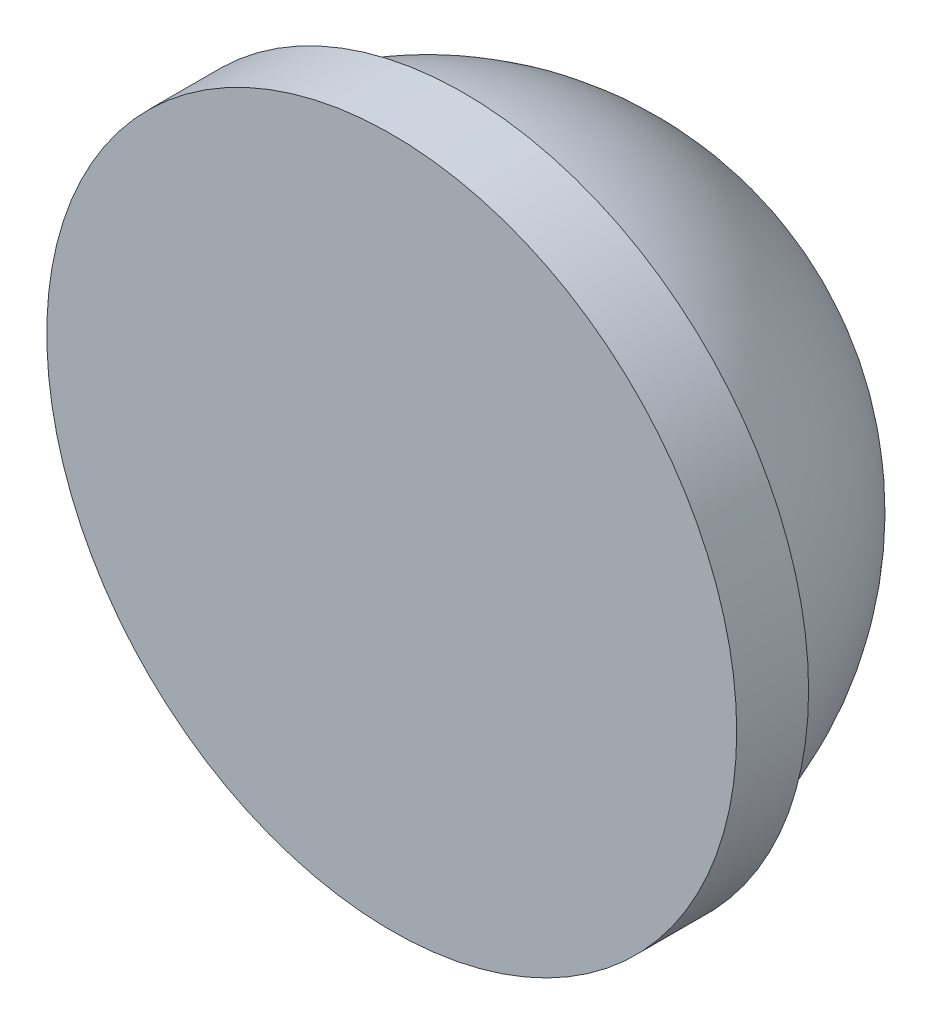
ISO-10303-21;
HEADER;
FILE_DESCRIPTION(('STEP AP214'),'2;1');
FILE_NAME('part.step','',(''),(''),'','','');
FILE_SCHEMA(('AUTOMOTIVE_DESIGN { 1 0 10303 214 1 1 1 1 }'));
ENDSEC;
DATA;
#1=APPLICATION_CONTEXT('core data for automotive mechanical design processes');
#2=APPLICATION_PROTOCOL_DEFINITION('international standard','automotive_design',2000,#1);
#3=PRODUCT_CONTEXT('',#1,'mechanical');
#4=PRODUCT('Part','Part','',(#3));
#5=PRODUCT_RELATED_PRODUCT_CATEGORY('part','',(#4));
#6=PRODUCT_DEFINITION_FORMATION('','',#4);
#7=PRODUCT_DEFINITION_CONTEXT('part definition',#1,'design');
#8=PRODUCT_DEFINITION('design','',#6,#7);
#9=PRODUCT_DEFINITION_SHAPE('','',#8);
#10=(LENGTH_UNIT() NAMED_UNIT(*) SI_UNIT(.MILLI.,.METRE.));
#11=(NAMED_UNIT(*) PLANE_ANGLE_UNIT() SI_UNIT($,.RADIAN.));
#12=(NAMED_UNIT(*) SI_UNIT($,.STERADIAN.) SOLID_ANGLE_UNIT());
#13=UNCERTAINTY_MEASURE_WITH_UNIT(LENGTH_MEASURE(1.E-05),#10,'distance_accuracy_value','');
#14=(GEOMETRIC_REPRESENTATION_CONTEXT(3) GLOBAL_UNCERTAINTY_ASSIGNED_CONTEXT((#13)) GLOBAL_UNIT_ASSIGNED_CONTEXT((#10,
#11,#12)) REPRESENTATION_CONTEXT('',''));
#15=CARTESIAN_POINT('',(0.,0.,0.));
#16=DIRECTION('',(0.,0.,1.));
#17=DIRECTION('',(1.,0.,0.));
#18=AXIS2_PLACEMENT_3D('',#15,#16,#17);
#19=CARTESIAN_POINT('',(0.,0.,0.));
#20=DIRECTION('',(0.,1.,0.));
#21=DIRECTION('',(0.,0.,-1.));
#22=AXIS2_PLACEMENT_3D('',#19,#20,#21);
#23=SPHERICAL_SURFACE('',#22,4.5);
#24=CARTESIAN_POINT('',(0.,-4.47213595499958,-0.500000000000001));
#25=CARTESIAN_POINT('',(-0.150997514664612,-4.47213887848108,-0.500000000000001));
#26=CARTESIAN_POINT('',(-0.301969495913377,-4.46448489805465,-0.500000000000001));
#27=CARTESIAN_POINT('',(-0.602482273010113,-4.43394007426907,-0.5));
#28=CARTESIAN_POINT('',(-0.752022119762018,-4.41103975193288,-0.5));
#29=CARTESIAN_POINT('',(-1.02307863973414,-4.3553539857282,-0.5));
#30=CARTESIAN_POINT('',(-1.14507673289361,-4.32488021057134,-0.5));
#31=CARTESIAN_POINT('',(-1.3861170686883,-4.25375942153719,-0.5));
#32=CARTESIAN_POINT('',(-1.50515844505664,-4.21310946397593,-0.5));
#33=CARTESIAN_POINT('',(-1.73948709294649,-4.12189355647516,-0.5));
#34=CARTESIAN_POINT('',(-1.85477128486625,-4.07131969942959,-0.5));
#35=CARTESIAN_POINT('',(-2.08070940666502,-3.96061604037249,-0.5));
#36=CARTESIAN_POINT('',(-2.19136162660478,-3.90048274802251,-0.5));
#37=CARTESIAN_POINT('',(-2.40711503658964,-3.77115412998921,-0.5));
#38=CARTESIAN_POINT('',(-2.51222064528998,-3.70196617534454,-0.499999999999999));
#39=CARTESIAN_POINT('',(-2.71626783258022,-3.55495522693636,-0.500000000000002));
#40=CARTESIAN_POINT('',(-2.81520712411537,-3.47712905871716,-0.500000000000004));
#41=CARTESIAN_POINT('',(-3.00611704982059,-3.31346626629332,-0.499999999999997));
#42=CARTESIAN_POINT('',(-3.09809190872835,-3.22763457005807,-0.499999999999987));
#43=CARTESIAN_POINT('',(-3.27451904332028,-3.04849717298061,-0.500000000000014));
#44=CARTESIAN_POINT('',(-3.35896853015982,-2.95518872544115,-0.500000000000052));
#45=CARTESIAN_POINT('',(-3.51968465250268,-2.76181489479289,-0.500000000000052));
#46=CARTESIAN_POINT('',(-3.59595347767667,-2.6617513315299,-0.500000000000014));
#47=CARTESIAN_POINT('',(-3.73981886528145,-2.45551787522962,-0.499999999999987));
#48=CARTESIAN_POINT('',(-3.80741221507932,-2.3493457410726,-0.499999999999997));
#49=CARTESIAN_POINT('',(-3.93339224115332,-2.13171957576029,-0.500000000000004));
#50=CARTESIAN_POINT('',(-3.99178192636582,-2.02026728639832,-0.500000000000001));
#51=CARTESIAN_POINT('',(-4.09898616509147,-1.79279863126298,-0.499999999999999));
#52=CARTESIAN_POINT('',(-4.14779717531719,-1.67678059553606,-0.5));
#53=CARTESIAN_POINT('',(-4.23545292877497,-1.44109010330004,-0.500000000000001));
#54=CARTESIAN_POINT('',(-4.27430153379665,-1.32141908301163,-0.500000000000001));
#55=CARTESIAN_POINT('',(-4.34179371461896,-1.0791855642772,-0.5));
#56=CARTESIAN_POINT('',(-4.37043351750144,-0.956622014629922,-0.5));
#57=CARTESIAN_POINT('',(-4.41727535839403,-0.709563064049558,-0.500000000000001));
#58=CARTESIAN_POINT('',(-4.43548127777803,-0.58506839920933,-0.500000000000001));
#59=CARTESIAN_POINT('',(-4.4613483228333,-0.334944134356463,-0.5));
#60=CARTESIAN_POINT('',(-4.46900555289547,-0.209314132296482,-0.5));
#61=CARTESIAN_POINT('',(-4.47370330378257,0.0421067366506264,-0.5));
#62=CARTESIAN_POINT('',(-4.47074773301795,0.167897527266524,-0.5));
#63=CARTESIAN_POINT('',(-4.45426150332976,0.418796730104734,-0.500000000000001));
#64=CARTESIAN_POINT('',(-4.44072694046182,0.543904873244761,-0.500000000000001));
#65=CARTESIAN_POINT('',(-4.38435427865963,0.916768604936239,-0.5));
#66=CARTESIAN_POINT('',(-4.32575205895234,1.16233640802484,-0.5));
#67=CARTESIAN_POINT('',(-4.16817661474933,1.64001540578852,-0.5));
#68=CARTESIAN_POINT('',(-4.06920289654609,1.87212643585958,-0.5));
#69=CARTESIAN_POINT('',(-3.83368748984246,2.31646802342857,-0.5));
#70=CARTESIAN_POINT('',(-3.69714677734392,2.52869909722178,-0.5));
#71=CARTESIAN_POINT('',(-3.39038630415402,2.92720365271011,-0.5));
#72=CARTESIAN_POINT('',(-3.22016866561958,3.11347876876418,-0.500000000000001));
#73=CARTESIAN_POINT('',(-2.85084401981479,3.45483950694928,-0.5));
#74=CARTESIAN_POINT('',(-2.65173262592018,3.60992038465297,-0.499999999999999));
#75=CARTESIAN_POINT('',(-2.2302624176303,3.88448582361263,-0.499999999999999));
#76=CARTESIAN_POINT('',(-2.00789725690763,4.00396063296944,-0.5));
#77=CARTESIAN_POINT('',(-1.54634080827002,4.20380349017741,-0.500000000000001));
#78=CARTESIAN_POINT('',(-1.30716139095409,4.2841988163888,-0.500000000000001));
#79=CARTESIAN_POINT('',(-0.889195891287265,4.38650885240195,-0.5));
#80=CARTESIAN_POINT('',(-0.71282189847408,4.4185924362847,-0.5));
#81=CARTESIAN_POINT('',(-0.35761830943598,4.46139393049345,-0.5));
#82=CARTESIAN_POINT('',(-0.178791255590018,4.47213249340004,-0.5));
#83=CARTESIAN_POINT('',(0.150997514664612,4.47213887848108,-0.5));
#84=CARTESIAN_POINT('',(0.301969495913377,4.46448489805465,-0.5));
#85=CARTESIAN_POINT('',(0.602482273010113,4.43394007426907,-0.5));
#86=CARTESIAN_POINT('',(0.752022119762018,4.41103975193288,-0.500000000000001));
#87=CARTESIAN_POINT('',(1.02307863973414,4.3553539857282,-0.500000000000001));
#88=CARTESIAN_POINT('',(1.14507673289361,4.32488021057134,-0.5));
#89=CARTESIAN_POINT('',(1.3861170686883,4.25375942153719,-0.5));
#90=CARTESIAN_POINT('',(1.50515844505664,4.21310946397593,-0.5));
#91=CARTESIAN_POINT('',(1.73948709294649,4.12189355647516,-0.5));
#92=CARTESIAN_POINT('',(1.85477128486625,4.07131969942959,-0.5));
#93=CARTESIAN_POINT('',(2.08070940666502,3.96061604037249,-0.5));
#94=CARTESIAN_POINT('',(2.19136162660478,3.90048274802251,-0.5));
#95=CARTESIAN_POINT('',(2.40711503658964,3.77115412998921,-0.5));
#96=CARTESIAN_POINT('',(2.51222064528998,3.70196617534453,-0.499999999999999));
#97=CARTESIAN_POINT('',(2.71626783258023,3.55495522693636,-0.500000000000002));
#98=CARTESIAN_POINT('',(2.81520712411537,3.47712905871716,-0.500000000000004));
#99=CARTESIAN_POINT('',(3.00611704982059,3.31346626629332,-0.499999999999997));
#100=CARTESIAN_POINT('',(3.09809190872835,3.22763457005807,-0.499999999999986));
#101=CARTESIAN_POINT('',(3.27451904332029,3.0484971729806,-0.500000000000015));
#102=CARTESIAN_POINT('',(3.35896853015982,2.95518872544114,-0.500000000000053));
#103=CARTESIAN_POINT('',(3.51968465250268,2.76181489479289,-0.500000000000053));
#104=CARTESIAN_POINT('',(3.59595347767668,2.6617513315299,-0.500000000000015));
#105=CARTESIAN_POINT('',(3.73981886528146,2.45551787522962,-0.499999999999986));
#106=CARTESIAN_POINT('',(3.80741221507932,2.34934574107259,-0.499999999999997));
#107=CARTESIAN_POINT('',(3.93339224115332,2.13171957576029,-0.500000000000004));
#108=CARTESIAN_POINT('',(3.99178192636583,2.02026728639832,-0.500000000000002));
#109=CARTESIAN_POINT('',(4.09898616509148,1.79279863126297,-0.499999999999999));
#110=CARTESIAN_POINT('',(4.14779717531719,1.67678059553606,-0.499999999999999));
#111=CARTESIAN_POINT('',(4.23545292877497,1.44109010330004,-0.5));
#112=CARTESIAN_POINT('',(4.27430153379665,1.32141908301163,-0.5));
#113=CARTESIAN_POINT('',(4.34179371461896,1.0791855642772,-0.500000000000001));
#114=CARTESIAN_POINT('',(4.37043351750144,0.956622014629919,-0.5));
#115=CARTESIAN_POINT('',(4.41727535839403,0.709563064049555,-0.5));
#116=CARTESIAN_POINT('',(4.43548127777803,0.585068399209327,-0.500000000000001));
#117=CARTESIAN_POINT('',(4.4613483228333,0.33494413435646,-0.5));
#118=CARTESIAN_POINT('',(4.46900555289547,0.209314132296478,-0.5));
#119=CARTESIAN_POINT('',(4.47370330378257,-0.0421067366506297,-0.5));
#120=CARTESIAN_POINT('',(4.47074773301795,-0.167897527266528,-0.5));
#121=CARTESIAN_POINT('',(4.45426150332976,-0.418796730104737,-0.500000000000001));
#122=CARTESIAN_POINT('',(4.44072694046182,-0.543904873244764,-0.500000000000001));
#123=CARTESIAN_POINT('',(4.38435427865963,-0.916768604936241,-0.5));
#124=CARTESIAN_POINT('',(4.32575205895234,-1.16233640802484,-0.5));
#125=CARTESIAN_POINT('',(4.16817661474933,-1.64001540578852,-0.5));
#126=CARTESIAN_POINT('',(4.06920289654608,-1.87212643585958,-0.5));
#127=CARTESIAN_POINT('',(3.83368748984246,-2.31646802342858,-0.500000000000001));
#128=CARTESIAN_POINT('',(3.69714677734392,-2.52869909722178,-0.5));
#129=CARTESIAN_POINT('',(3.39038630415402,-2.92720365271011,-0.500000000000001));
#130=CARTESIAN_POINT('',(3.22016866561958,-3.11347876876418,-0.500000000000001));
#131=CARTESIAN_POINT('',(2.85084401981479,-3.45483950694928,-0.5));
#132=CARTESIAN_POINT('',(2.65173262592018,-3.60992038465297,-0.499999999999999));
#133=CARTESIAN_POINT('',(2.2302624176303,-3.88448582361263,-0.499999999999999));
#134=CARTESIAN_POINT('',(2.00789725690763,-4.00396063296944,-0.5));
#135=CARTESIAN_POINT('',(1.54634080827002,-4.20380349017741,-0.500000000000001));
#136=CARTESIAN_POINT('',(1.30716139095409,-4.2841988163888,-0.5));
#137=CARTESIAN_POINT('',(0.889195891287263,-4.38650885240195,-0.5));
#138=CARTESIAN_POINT('',(0.712821898474079,-4.4185924362847,-0.5));
#139=CARTESIAN_POINT('',(0.357618309435979,-4.46139393049345,-0.500000000000001));
#140=CARTESIAN_POINT('',(0.178791255590018,-4.47213249340004,-0.500000000000001));
#141=CARTESIAN_POINT('',(0.,-4.47213595499958,-0.500000000000001));
#142=B_SPLINE_CURVE_WITH_KNOTS('',3,(#24,#25,#26,#27,#28,#29,#30,#31,#32,#33,#34,#35,#36,#37,
#38,#39,#40,#41,#42,#43,#44,#45,#46,#47,#48,#49,#50,#51,#52,#53,#54,#55,#56,#57,#58,#59,#60,#61,
#62,#63,#64,#65,#66,#67,#68,#69,#70,#71,#72,#73,#74,#75,#76,#77,#78,#79,#80,#81,#82,#83,#84,#85,
#86,#87,#88,#89,#90,#91,#92,#93,#94,#95,#96,#97,#98,#99,#100,#101,#102,#103,#104,#105,#106,#107,
#108,#109,#110,#111,#112,#113,#114,#115,#116,#117,#118,#119,#120,#121,#122,#123,#124,#125,#126,
#127,#128,#129,#130,#131,#132,#133,#134,#135,#136,#137,#138,#139,#140,#141),.UNSPECIFIED.,.T.,
.F.,(4,2,2,2,2,2,2,2,2,2,2,2,2,2,2,2,2,2,2,2,2,2,2,2,2,2,2,2,2,2,2,2,2,2,2,2,2,2,2,2,2,2,2,2,2,
2,2,2,2,2,2,2,2,2,2,2,2,2,4),(0.,0.452759592057519,0.905800937637214,1.28261206959558,
1.65953232864876,2.03675413646417,2.41411399308629,2.79116854508421,3.1683621224618,
3.54532502391733,3.92242704892076,4.2994278839777,4.67656792663595,5.05358441474362,
5.43074010477785,5.80774937383516,6.18489783198708,6.56190590080622,6.93905316063406,
7.31606154146879,7.69320911467799,8.44669571679005,9.20019153364948,9.95366777630856,
10.7070965536552,11.4606398357926,12.2143893114069,12.9676118946624,13.5042292931668,
14.0403272291109,14.4930868211684,14.9461281667481,15.3229392987065,15.6998595577597,
16.0770813655751,16.4544412221972,16.8314957741951,17.2086893515727,17.5856522530283,
17.9627542780317,18.3397551130886,18.7168951557469,19.0939116438545,19.4710673338888,
19.8480766029461,20.225225061098,20.6022331299171,20.979380389745,21.3563887705797,
21.7335363437889,22.487022945901,23.2405187627604,23.9939950054195,24.7474237827661,
25.5009670649035,26.2547165405178,27.0079391237733,27.5445565222777,28.0806544582218),.UNSPECIFIED.);
#143=CARTESIAN_POINT('',(0.,-4.47213595499958,-0.500000000000001));
#144=VERTEX_POINT('',#143);
#145=EDGE_CURVE('E20',#144,#144,#142,.T.);
#146=ORIENTED_EDGE('',*,*,#145,.T.);
#147=EDGE_LOOP('',(#146));
#148=FACE_BOUND('',#147,.T.);
#149=ADVANCED_FACE('F15',(#148),#23,.T.);
#150=CARTESIAN_POINT('',(0.,4.47213595499958,-0.5));
#151=DIRECTION('',(0.,0.,1.));
#152=DIRECTION('',(1.,0.,0.));
#153=AXIS2_PLACEMENT_3D('',#150,#151,#152);
#154=PLANE('',#153);
#155=ORIENTED_EDGE('',*,*,#145,.F.);
#156=EDGE_LOOP('',(#155));
#157=FACE_BOUND('',#156,.T.);
#158=CARTESIAN_POINT('',(0.,0.,-0.5));
#159=DIRECTION('',(0.,0.,1.));
#160=DIRECTION('',(1.,0.,0.));
#161=AXIS2_PLACEMENT_3D('',#158,#159,#160);
#162=CIRCLE('',#161,4.8);
#163=CARTESIAN_POINT('',(4.8,0.,-0.5));
#164=VERTEX_POINT('',#163);
#165=EDGE_CURVE('E26',#164,#164,#162,.T.);
#166=ORIENTED_EDGE('',*,*,#165,.F.);
#167=EDGE_LOOP('',(#166));
#168=FACE_BOUND('',#167,.T.);
#169=ADVANCED_FACE('F38',(#157,#168),#154,.F.);
#170=CARTESIAN_POINT('',(0.,0.,0.5));
#171=DIRECTION('',(0.,0.,1.));
#172=DIRECTION('',(1.,0.,0.));
#173=AXIS2_PLACEMENT_3D('',#170,#171,#172);
#174=CYLINDRICAL_SURFACE('',#173,4.8);
#175=CARTESIAN_POINT('',(0.,0.,0.5));
#176=DIRECTION('',(0.,0.,1.));
#177=DIRECTION('',(1.,0.,0.));
#178=AXIS2_PLACEMENT_3D('',#175,#176,#177);
#179=CIRCLE('',#178,4.8);
#180=CARTESIAN_POINT('',(4.8,0.,0.5));
#181=VERTEX_POINT('',#180);
#182=EDGE_CURVE('E10',#181,#181,#179,.F.);
#183=ORIENTED_EDGE('',*,*,#182,.T.);
#184=EDGE_LOOP('',(#183));
#185=FACE_BOUND('',#184,.T.);
#186=ORIENTED_EDGE('',*,*,#165,.T.);
#187=EDGE_LOOP('',(#186));
#188=FACE_BOUND('',#187,.T.);
#189=ADVANCED_FACE('F41',(#185,#188),#174,.T.);
#190=CARTESIAN_POINT('',(0.,0.,0.5));
#191=DIRECTION('',(0.,0.,-1.));
#192=DIRECTION('',(-1.,0.,0.));
#193=AXIS2_PLACEMENT_3D('',#190,#191,#192);
#194=PLANE('',#193);
#195=ORIENTED_EDGE('',*,*,#182,.F.);
#196=EDGE_LOOP('',(#195));
#197=FACE_BOUND('',#196,.T.);
#198=ADVANCED_FACE('F47',(#197),#194,.F.);
#199=CLOSED_SHELL('',(#149,#169,#189,#198));
#200=MANIFOLD_SOLID_BREP('B1',#199);
#201=ADVANCED_BREP_SHAPE_REPRESENTATION('',(#18,#200),#14);
#202=SHAPE_DEFINITION_REPRESENTATION(#9,#201);
ENDSEC;
END-ISO-10303-21;
